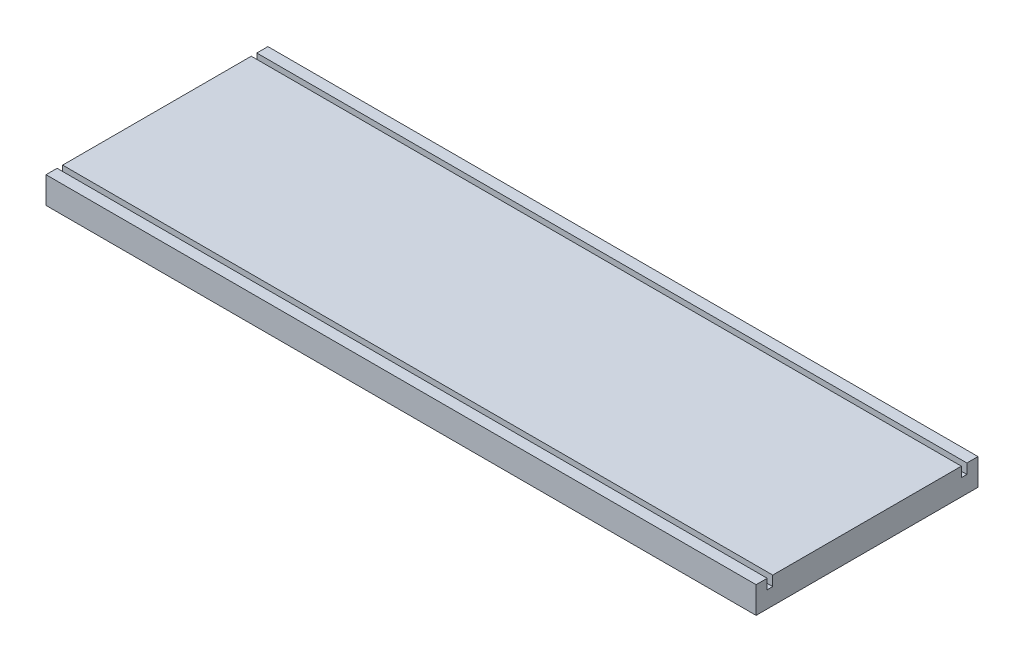
ISO-10303-21;
HEADER;
FILE_DESCRIPTION(('STEP AP214'),'2;1');
FILE_NAME('part.step','',(''),(''),'','','');
FILE_SCHEMA(('AUTOMOTIVE_DESIGN { 1 0 10303 214 1 1 1 1 }'));
ENDSEC;
DATA;
#1=APPLICATION_CONTEXT('core data for automotive mechanical design processes');
#2=APPLICATION_PROTOCOL_DEFINITION('international standard','automotive_design',2000,#1);
#3=PRODUCT_CONTEXT('',#1,'mechanical');
#4=PRODUCT('Part','Part','',(#3));
#5=PRODUCT_RELATED_PRODUCT_CATEGORY('part','',(#4));
#6=PRODUCT_DEFINITION_FORMATION('','',#4);
#7=PRODUCT_DEFINITION_CONTEXT('part definition',#1,'design');
#8=PRODUCT_DEFINITION('design','',#6,#7);
#9=PRODUCT_DEFINITION_SHAPE('','',#8);
#10=(LENGTH_UNIT() NAMED_UNIT(*) SI_UNIT(.MILLI.,.METRE.));
#11=(NAMED_UNIT(*) PLANE_ANGLE_UNIT() SI_UNIT($,.RADIAN.));
#12=(NAMED_UNIT(*) SI_UNIT($,.STERADIAN.) SOLID_ANGLE_UNIT());
#13=UNCERTAINTY_MEASURE_WITH_UNIT(LENGTH_MEASURE(1.E-05),#10,'distance_accuracy_value','');
#14=(GEOMETRIC_REPRESENTATION_CONTEXT(3) GLOBAL_UNCERTAINTY_ASSIGNED_CONTEXT((#13)) GLOBAL_UNIT_ASSIGNED_CONTEXT((#10,
#11,#12)) REPRESENTATION_CONTEXT('',''));
#15=CARTESIAN_POINT('',(0.,0.,0.));
#16=DIRECTION('',(0.,0.,1.));
#17=DIRECTION('',(1.,0.,0.));
#18=AXIS2_PLACEMENT_3D('',#15,#16,#17);
#19=CARTESIAN_POINT('',(0.,6.,0.));
#20=DIRECTION('',(0.,1.,0.));
#21=DIRECTION('',(0.,0.,1.));
#22=AXIS2_PLACEMENT_3D('',#19,#20,#21);
#23=PLANE('',#22);
#24=DIRECTION('',(0.,0.,1.));
#25=VECTOR('',#24,1.);
#26=CARTESIAN_POINT('',(-80.,6.,25.));
#27=LINE('',#26,#25);
#28=CARTESIAN_POINT('',(-80.,6.,-25.));
#29=VERTEX_POINT('',#28);
#30=CARTESIAN_POINT('',(-80.,6.,-22.5));
#31=VERTEX_POINT('',#30);
#32=EDGE_CURVE('E196',#29,#31,#27,.T.);
#33=ORIENTED_EDGE('',*,*,#32,.T.);
#34=DIRECTION('',(1.,0.,0.));
#35=VECTOR('',#34,1.);
#36=CARTESIAN_POINT('',(-80.,6.,-22.5));
#37=LINE('',#36,#35);
#38=CARTESIAN_POINT('',(80.,6.,-22.5));
#39=VERTEX_POINT('',#38);
#40=EDGE_CURVE('E146',#31,#39,#37,.T.);
#41=ORIENTED_EDGE('',*,*,#40,.T.);
#42=DIRECTION('',(0.,0.,-1.));
#43=VECTOR('',#42,1.);
#44=CARTESIAN_POINT('',(80.,6.,25.));
#45=LINE('',#44,#43);
#46=CARTESIAN_POINT('',(80.,6.,-25.));
#47=VERTEX_POINT('',#46);
#48=EDGE_CURVE('E204',#39,#47,#45,.T.);
#49=ORIENTED_EDGE('',*,*,#48,.T.);
#50=DIRECTION('',(-1.,0.,0.));
#51=VECTOR('',#50,1.);
#52=CARTESIAN_POINT('',(80.,6.,-25.));
#53=LINE('',#52,#51);
#54=EDGE_CURVE('E209',#47,#29,#53,.T.);
#55=ORIENTED_EDGE('',*,*,#54,.T.);
#56=EDGE_LOOP('',(#33,#41,#49,#55));
#57=FACE_BOUND('',#56,.T.);
#58=ADVANCED_FACE('F39',(#57),#23,.T.);
#59=CARTESIAN_POINT('',(80.,6.,21.25));
#60=VERTEX_POINT('',#59);
#61=CARTESIAN_POINT('',(80.,6.,-21.25));
#62=VERTEX_POINT('',#61);
#63=EDGE_CURVE('E210',#60,#62,#45,.T.);
#64=ORIENTED_EDGE('',*,*,#63,.T.);
#65=DIRECTION('',(-1.,0.,0.));
#66=VECTOR('',#65,1.);
#67=CARTESIAN_POINT('',(-80.,6.,-21.25));
#68=LINE('',#67,#66);
#69=CARTESIAN_POINT('',(-80.,6.,-21.25));
#70=VERTEX_POINT('',#69);
#71=EDGE_CURVE('E263',#62,#70,#68,.T.);
#72=ORIENTED_EDGE('',*,*,#71,.T.);
#73=CARTESIAN_POINT('',(-80.,6.,21.25));
#74=VERTEX_POINT('',#73);
#75=EDGE_CURVE('E150',#70,#74,#27,.T.);
#76=ORIENTED_EDGE('',*,*,#75,.T.);
#77=DIRECTION('',(-1.,0.,0.));
#78=VECTOR('',#77,1.);
#79=CARTESIAN_POINT('',(-80.,6.,21.25));
#80=LINE('',#79,#78);
#81=EDGE_CURVE('E165',#60,#74,#80,.T.);
#82=ORIENTED_EDGE('',*,*,#81,.F.);
#83=EDGE_LOOP('',(#64,#72,#76,#82));
#84=FACE_BOUND('',#83,.T.);
#85=ADVANCED_FACE('F262',(#84),#23,.T.);
#86=CARTESIAN_POINT('',(-80.,6.,25.));
#87=DIRECTION('',(1.,0.,0.));
#88=DIRECTION('',(0.,0.,-1.));
#89=AXIS2_PLACEMENT_3D('',#86,#87,#88);
#90=PLANE('',#89);
#91=DIRECTION('',(0.,1.,0.));
#92=VECTOR('',#91,1.);
#93=CARTESIAN_POINT('',(-80.,3.75,-22.5));
#94=LINE('',#93,#92);
#95=CARTESIAN_POINT('',(-80.,3.75,-22.5));
#96=VERTEX_POINT('',#95);
#97=EDGE_CURVE('E179',#96,#31,#94,.T.);
#98=ORIENTED_EDGE('',*,*,#97,.T.);
#99=ORIENTED_EDGE('',*,*,#32,.F.);
#100=DIRECTION('',(0.,-1.,0.));
#101=VECTOR('',#100,1.);
#102=CARTESIAN_POINT('',(-80.,6.,-25.));
#103=LINE('',#102,#101);
#104=CARTESIAN_POINT('',(-80.,0.,-25.));
#105=VERTEX_POINT('',#104);
#106=EDGE_CURVE('E213',#29,#105,#103,.T.);
#107=ORIENTED_EDGE('',*,*,#106,.T.);
#108=DIRECTION('',(0.,0.,1.));
#109=VECTOR('',#108,1.);
#110=CARTESIAN_POINT('',(-80.,0.,25.));
#111=LINE('',#110,#109);
#112=CARTESIAN_POINT('',(-80.,0.,25.));
#113=VERTEX_POINT('',#112);
#114=EDGE_CURVE('E186',#105,#113,#111,.T.);
#115=ORIENTED_EDGE('',*,*,#114,.T.);
#116=DIRECTION('',(0.,-1.,0.));
#117=VECTOR('',#116,1.);
#118=CARTESIAN_POINT('',(-80.,6.,25.));
#119=LINE('',#118,#117);
#120=CARTESIAN_POINT('',(-80.,6.,25.));
#121=VERTEX_POINT('',#120);
#122=EDGE_CURVE('E11',#121,#113,#119,.T.);
#123=ORIENTED_EDGE('',*,*,#122,.F.);
#124=CARTESIAN_POINT('',(-80.,6.,22.5));
#125=VERTEX_POINT('',#124);
#126=EDGE_CURVE('E201',#125,#121,#27,.T.);
#127=ORIENTED_EDGE('',*,*,#126,.F.);
#128=DIRECTION('',(0.,1.,0.));
#129=VECTOR('',#128,1.);
#130=CARTESIAN_POINT('',(-80.,3.75,22.5));
#131=LINE('',#130,#129);
#132=CARTESIAN_POINT('',(-80.,3.75,22.5));
#133=VERTEX_POINT('',#132);
#134=EDGE_CURVE('E63',#133,#125,#131,.T.);
#135=ORIENTED_EDGE('',*,*,#134,.F.);
#136=DIRECTION('',(0.,0.,1.));
#137=VECTOR('',#136,1.);
#138=CARTESIAN_POINT('',(-80.,3.75,22.5));
#139=LINE('',#138,#137);
#140=CARTESIAN_POINT('',(-80.,3.75,21.25));
#141=VERTEX_POINT('',#140);
#142=EDGE_CURVE('E160',#141,#133,#139,.T.);
#143=ORIENTED_EDGE('',*,*,#142,.F.);
#144=DIRECTION('',(0.,1.,0.));
#145=VECTOR('',#144,1.);
#146=CARTESIAN_POINT('',(-80.,3.75,21.25));
#147=LINE('',#146,#145);
#148=EDGE_CURVE('E183',#141,#74,#147,.T.);
#149=ORIENTED_EDGE('',*,*,#148,.T.);
#150=ORIENTED_EDGE('',*,*,#75,.F.);
#151=DIRECTION('',(0.,1.,0.));
#152=VECTOR('',#151,1.);
#153=CARTESIAN_POINT('',(-80.,3.75,-21.25));
#154=LINE('',#153,#152);
#155=CARTESIAN_POINT('',(-80.,3.75,-21.25));
#156=VERTEX_POINT('',#155);
#157=EDGE_CURVE('E130',#156,#70,#154,.T.);
#158=ORIENTED_EDGE('',*,*,#157,.F.);
#159=DIRECTION('',(0.,0.,-1.));
#160=VECTOR('',#159,1.);
#161=CARTESIAN_POINT('',(-80.,3.75,-22.5));
#162=LINE('',#161,#160);
#163=EDGE_CURVE('E137',#156,#96,#162,.T.);
#164=ORIENTED_EDGE('',*,*,#163,.T.);
#165=EDGE_LOOP('',(#98,#99,#107,#115,#123,#127,#135,#143,#149,#150,#158,#164));
#166=FACE_BOUND('',#165,.T.);
#167=ADVANCED_FACE('F41',(#166),#90,.F.);
#168=CARTESIAN_POINT('',(80.,6.,25.));
#169=DIRECTION('',(-1.,0.,0.));
#170=DIRECTION('',(0.,0.,1.));
#171=AXIS2_PLACEMENT_3D('',#168,#169,#170);
#172=PLANE('',#171);
#173=DIRECTION('',(0.,1.,0.));
#174=VECTOR('',#173,1.);
#175=CARTESIAN_POINT('',(80.,3.75,-22.5));
#176=LINE('',#175,#174);
#177=CARTESIAN_POINT('',(80.,3.75,-22.5));
#178=VERTEX_POINT('',#177);
#179=EDGE_CURVE('E155',#178,#39,#176,.T.);
#180=ORIENTED_EDGE('',*,*,#179,.F.);
#181=DIRECTION('',(0.,0.,1.));
#182=VECTOR('',#181,1.);
#183=CARTESIAN_POINT('',(80.,3.75,-22.5));
#184=LINE('',#183,#182);
#185=CARTESIAN_POINT('',(80.,3.75,-21.25));
#186=VERTEX_POINT('',#185);
#187=EDGE_CURVE('E136',#178,#186,#184,.T.);
#188=ORIENTED_EDGE('',*,*,#187,.T.);
#189=DIRECTION('',(0.,1.,0.));
#190=VECTOR('',#189,1.);
#191=CARTESIAN_POINT('',(80.,3.75,-21.25));
#192=LINE('',#191,#190);
#193=EDGE_CURVE('E133',#186,#62,#192,.T.);
#194=ORIENTED_EDGE('',*,*,#193,.T.);
#195=ORIENTED_EDGE('',*,*,#63,.F.);
#196=DIRECTION('',(0.,1.,0.));
#197=VECTOR('',#196,1.);
#198=CARTESIAN_POINT('',(80.,3.75,21.25));
#199=LINE('',#198,#197);
#200=CARTESIAN_POINT('',(80.,3.75,21.25));
#201=VERTEX_POINT('',#200);
#202=EDGE_CURVE('E187',#201,#60,#199,.T.);
#203=ORIENTED_EDGE('',*,*,#202,.F.);
#204=DIRECTION('',(0.,0.,-1.));
#205=VECTOR('',#204,1.);
#206=CARTESIAN_POINT('',(80.,3.75,22.5));
#207=LINE('',#206,#205);
#208=CARTESIAN_POINT('',(80.,3.75,22.5));
#209=VERTEX_POINT('',#208);
#210=EDGE_CURVE('E169',#209,#201,#207,.T.);
#211=ORIENTED_EDGE('',*,*,#210,.F.);
#212=DIRECTION('',(0.,1.,0.));
#213=VECTOR('',#212,1.);
#214=CARTESIAN_POINT('',(80.,3.75,22.5));
#215=LINE('',#214,#213);
#216=CARTESIAN_POINT('',(80.,6.,22.5));
#217=VERTEX_POINT('',#216);
#218=EDGE_CURVE('E190',#209,#217,#215,.T.);
#219=ORIENTED_EDGE('',*,*,#218,.T.);
#220=CARTESIAN_POINT('',(80.,6.,25.));
#221=VERTEX_POINT('',#220);
#222=EDGE_CURVE('E205',#221,#217,#45,.T.);
#223=ORIENTED_EDGE('',*,*,#222,.F.);
#224=DIRECTION('',(0.,-1.,0.));
#225=VECTOR('',#224,1.);
#226=CARTESIAN_POINT('',(80.,6.,25.));
#227=LINE('',#226,#225);
#228=CARTESIAN_POINT('',(80.,0.,25.));
#229=VERTEX_POINT('',#228);
#230=EDGE_CURVE('E48',#221,#229,#227,.T.);
#231=ORIENTED_EDGE('',*,*,#230,.T.);
#232=DIRECTION('',(0.,0.,-1.));
#233=VECTOR('',#232,1.);
#234=CARTESIAN_POINT('',(80.,0.,25.));
#235=LINE('',#234,#233);
#236=CARTESIAN_POINT('',(80.,0.,-25.));
#237=VERTEX_POINT('',#236);
#238=EDGE_CURVE('E220',#229,#237,#235,.T.);
#239=ORIENTED_EDGE('',*,*,#238,.T.);
#240=DIRECTION('',(0.,-1.,0.));
#241=VECTOR('',#240,1.);
#242=CARTESIAN_POINT('',(80.,6.,-25.));
#243=LINE('',#242,#241);
#244=EDGE_CURVE('E229',#47,#237,#243,.T.);
#245=ORIENTED_EDGE('',*,*,#244,.F.);
#246=ORIENTED_EDGE('',*,*,#48,.F.);
#247=EDGE_LOOP('',(#180,#188,#194,#195,#203,#211,#219,#223,#231,#239,#245,#246));
#248=FACE_BOUND('',#247,.T.);
#249=ADVANCED_FACE('F239',(#248),#172,.F.);
#250=CARTESIAN_POINT('',(80.,6.,25.));
#251=DIRECTION('',(0.,0.,-1.));
#252=DIRECTION('',(-1.,0.,0.));
#253=AXIS2_PLACEMENT_3D('',#250,#251,#252);
#254=PLANE('',#253);
#255=DIRECTION('',(1.,0.,0.));
#256=VECTOR('',#255,1.);
#257=CARTESIAN_POINT('',(80.,0.,25.));
#258=LINE('',#257,#256);
#259=EDGE_CURVE('E217',#113,#229,#258,.T.);
#260=ORIENTED_EDGE('',*,*,#259,.T.);
#261=ORIENTED_EDGE('',*,*,#230,.F.);
#262=DIRECTION('',(1.,0.,0.));
#263=VECTOR('',#262,1.);
#264=CARTESIAN_POINT('',(80.,6.,25.));
#265=LINE('',#264,#263);
#266=EDGE_CURVE('E200',#121,#221,#265,.T.);
#267=ORIENTED_EDGE('',*,*,#266,.F.);
#268=ORIENTED_EDGE('',*,*,#122,.T.);
#269=EDGE_LOOP('',(#260,#261,#267,#268));
#270=FACE_BOUND('',#269,.T.);
#271=ADVANCED_FACE('F304',(#270),#254,.F.);
#272=CARTESIAN_POINT('',(80.,6.,-25.));
#273=DIRECTION('',(0.,0.,1.));
#274=DIRECTION('',(1.,0.,0.));
#275=AXIS2_PLACEMENT_3D('',#272,#273,#274);
#276=PLANE('',#275);
#277=DIRECTION('',(-1.,0.,0.));
#278=VECTOR('',#277,1.);
#279=CARTESIAN_POINT('',(80.,0.,-25.));
#280=LINE('',#279,#278);
#281=EDGE_CURVE('E223',#237,#105,#280,.T.);
#282=ORIENTED_EDGE('',*,*,#281,.T.);
#283=ORIENTED_EDGE('',*,*,#106,.F.);
#284=ORIENTED_EDGE('',*,*,#54,.F.);
#285=ORIENTED_EDGE('',*,*,#244,.T.);
#286=EDGE_LOOP('',(#282,#283,#284,#285));
#287=FACE_BOUND('',#286,.T.);
#288=ADVANCED_FACE('F249',(#287),#276,.F.);
#289=DIRECTION('',(1.,0.,0.));
#290=VECTOR('',#289,1.);
#291=CARTESIAN_POINT('',(-80.,6.,22.5));
#292=LINE('',#291,#290);
#293=EDGE_CURVE('E176',#125,#217,#292,.T.);
#294=ORIENTED_EDGE('',*,*,#293,.F.);
#295=ORIENTED_EDGE('',*,*,#126,.T.);
#296=ORIENTED_EDGE('',*,*,#266,.T.);
#297=ORIENTED_EDGE('',*,*,#222,.T.);
#298=EDGE_LOOP('',(#294,#295,#296,#297));
#299=FACE_BOUND('',#298,.T.);
#300=ADVANCED_FACE('F291',(#299),#23,.T.);
#301=CARTESIAN_POINT('',(0.,0.,0.));
#302=DIRECTION('',(0.,1.,0.));
#303=DIRECTION('',(0.,0.,1.));
#304=AXIS2_PLACEMENT_3D('',#301,#302,#303);
#305=PLANE('',#304);
#306=ORIENTED_EDGE('',*,*,#114,.F.);
#307=ORIENTED_EDGE('',*,*,#281,.F.);
#308=ORIENTED_EDGE('',*,*,#238,.F.);
#309=ORIENTED_EDGE('',*,*,#259,.F.);
#310=EDGE_LOOP('',(#306,#307,#308,#309));
#311=FACE_BOUND('',#310,.T.);
#312=ADVANCED_FACE('F246',(#311),#305,.F.);
#313=CARTESIAN_POINT('',(-80.,3.75,21.25));
#314=DIRECTION('',(0.,0.,-1.));
#315=DIRECTION('',(-1.,0.,0.));
#316=AXIS2_PLACEMENT_3D('',#313,#314,#315);
#317=PLANE('',#316);
#318=ORIENTED_EDGE('',*,*,#81,.T.);
#319=ORIENTED_EDGE('',*,*,#148,.F.);
#320=DIRECTION('',(-1.,0.,0.));
#321=VECTOR('',#320,1.);
#322=CARTESIAN_POINT('',(-80.,3.75,21.25));
#323=LINE('',#322,#321);
#324=EDGE_CURVE('E172',#201,#141,#323,.T.);
#325=ORIENTED_EDGE('',*,*,#324,.F.);
#326=ORIENTED_EDGE('',*,*,#202,.T.);
#327=EDGE_LOOP('',(#318,#319,#325,#326));
#328=FACE_BOUND('',#327,.T.);
#329=ADVANCED_FACE('F303',(#328),#317,.F.);
#330=CARTESIAN_POINT('',(-80.,3.75,22.5));
#331=DIRECTION('',(0.,0.,1.));
#332=DIRECTION('',(1.,0.,0.));
#333=AXIS2_PLACEMENT_3D('',#330,#331,#332);
#334=PLANE('',#333);
#335=ORIENTED_EDGE('',*,*,#293,.T.);
#336=ORIENTED_EDGE('',*,*,#218,.F.);
#337=DIRECTION('',(1.,0.,0.));
#338=VECTOR('',#337,1.);
#339=CARTESIAN_POINT('',(-80.,3.75,22.5));
#340=LINE('',#339,#338);
#341=EDGE_CURVE('E164',#133,#209,#340,.T.);
#342=ORIENTED_EDGE('',*,*,#341,.F.);
#343=ORIENTED_EDGE('',*,*,#134,.T.);
#344=EDGE_LOOP('',(#335,#336,#342,#343));
#345=FACE_BOUND('',#344,.T.);
#346=ADVANCED_FACE('F285',(#345),#334,.F.);
#347=CARTESIAN_POINT('',(0.,3.75,0.));
#348=DIRECTION('',(0.,-1.,0.));
#349=DIRECTION('',(0.,0.,-1.));
#350=AXIS2_PLACEMENT_3D('',#347,#348,#349);
#351=PLANE('',#350);
#352=ORIENTED_EDGE('',*,*,#142,.T.);
#353=ORIENTED_EDGE('',*,*,#341,.T.);
#354=ORIENTED_EDGE('',*,*,#210,.T.);
#355=ORIENTED_EDGE('',*,*,#324,.T.);
#356=EDGE_LOOP('',(#352,#353,#354,#355));
#357=FACE_BOUND('',#356,.T.);
#358=ADVANCED_FACE('F278',(#357),#351,.F.);
#359=CARTESIAN_POINT('',(-80.,3.75,-22.5));
#360=DIRECTION('',(0.,0.,1.));
#361=DIRECTION('',(1.,0.,0.));
#362=AXIS2_PLACEMENT_3D('',#359,#360,#361);
#363=PLANE('',#362);
#364=ORIENTED_EDGE('',*,*,#40,.F.);
#365=ORIENTED_EDGE('',*,*,#97,.F.);
#366=DIRECTION('',(1.,0.,0.));
#367=VECTOR('',#366,1.);
#368=CARTESIAN_POINT('',(-80.,3.75,-22.5));
#369=LINE('',#368,#367);
#370=EDGE_CURVE('E141',#96,#178,#369,.T.);
#371=ORIENTED_EDGE('',*,*,#370,.T.);
#372=ORIENTED_EDGE('',*,*,#179,.T.);
#373=EDGE_LOOP('',(#364,#365,#371,#372));
#374=FACE_BOUND('',#373,.T.);
#375=ADVANCED_FACE('F276',(#374),#363,.T.);
#376=CARTESIAN_POINT('',(-80.,3.75,-21.25));
#377=DIRECTION('',(0.,0.,-1.));
#378=DIRECTION('',(-1.,0.,0.));
#379=AXIS2_PLACEMENT_3D('',#376,#377,#378);
#380=PLANE('',#379);
#381=ORIENTED_EDGE('',*,*,#71,.F.);
#382=ORIENTED_EDGE('',*,*,#193,.F.);
#383=DIRECTION('',(-1.,0.,0.));
#384=VECTOR('',#383,1.);
#385=CARTESIAN_POINT('',(-80.,3.75,-21.25));
#386=LINE('',#385,#384);
#387=EDGE_CURVE('E55',#186,#156,#386,.T.);
#388=ORIENTED_EDGE('',*,*,#387,.T.);
#389=ORIENTED_EDGE('',*,*,#157,.T.);
#390=EDGE_LOOP('',(#381,#382,#388,#389));
#391=FACE_BOUND('',#390,.T.);
#392=ADVANCED_FACE('F128',(#391),#380,.T.);
#393=CARTESIAN_POINT('',(0.,3.75,0.));
#394=DIRECTION('',(0.,-1.,0.));
#395=DIRECTION('',(0.,0.,1.));
#396=AXIS2_PLACEMENT_3D('',#393,#394,#395);
#397=PLANE('',#396);
#398=ORIENTED_EDGE('',*,*,#163,.F.);
#399=ORIENTED_EDGE('',*,*,#387,.F.);
#400=ORIENTED_EDGE('',*,*,#187,.F.);
#401=ORIENTED_EDGE('',*,*,#370,.F.);
#402=EDGE_LOOP('',(#398,#399,#400,#401));
#403=FACE_BOUND('',#402,.T.);
#404=ADVANCED_FACE('F140',(#403),#397,.F.);
#405=CLOSED_SHELL('',(#58,#85,#167,#249,#271,#288,#300,#312,#329,#346,#358,#375,#392,#404));
#406=MANIFOLD_SOLID_BREP('B2',#405);
#407=ADVANCED_BREP_SHAPE_REPRESENTATION('',(#18,#406),#14);
#408=SHAPE_DEFINITION_REPRESENTATION(#9,#407);
ENDSEC;
END-ISO-10303-21;
